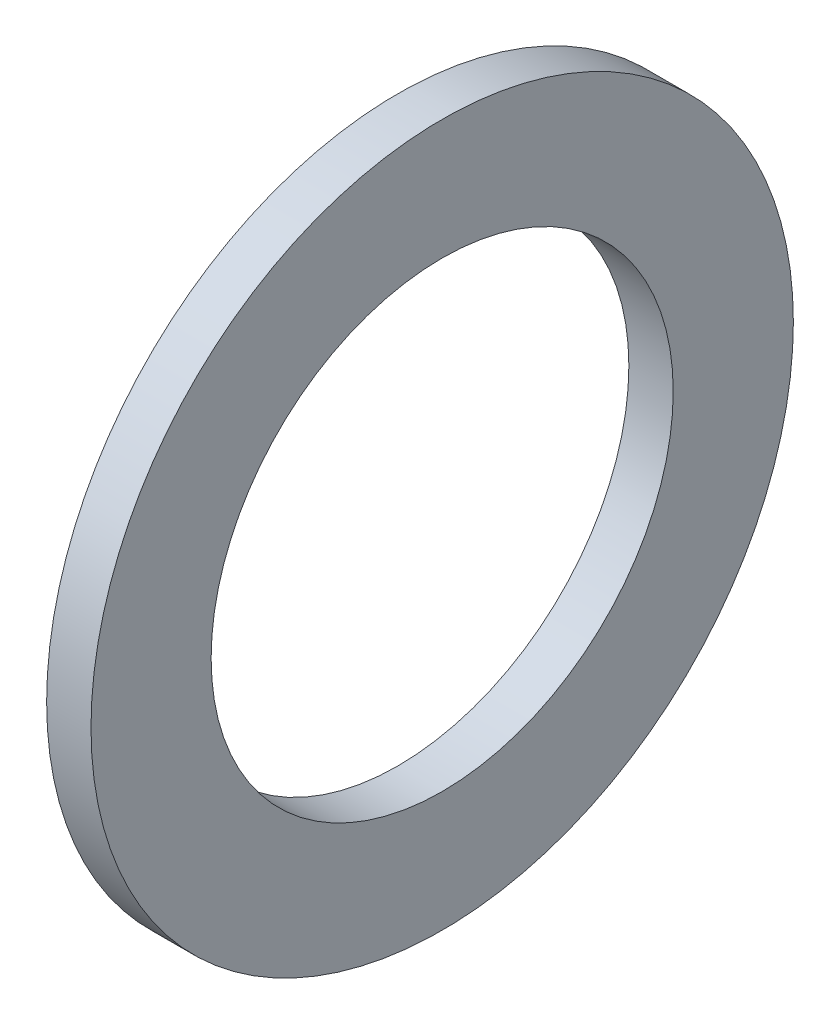
ISO-10303-21;
HEADER;
FILE_DESCRIPTION(('STEP AP214'),'2;1');
FILE_NAME('part.step','',(''),(''),'','','');
FILE_SCHEMA(('AUTOMOTIVE_DESIGN { 1 0 10303 214 1 1 1 1 }'));
ENDSEC;
DATA;
#1=APPLICATION_CONTEXT('core data for automotive mechanical design processes');
#2=APPLICATION_PROTOCOL_DEFINITION('international standard','automotive_design',2000,#1);
#3=PRODUCT_CONTEXT('',#1,'mechanical');
#4=PRODUCT('Part','Part','',(#3));
#5=PRODUCT_RELATED_PRODUCT_CATEGORY('part','',(#4));
#6=PRODUCT_DEFINITION_FORMATION('','',#4);
#7=PRODUCT_DEFINITION_CONTEXT('part definition',#1,'design');
#8=PRODUCT_DEFINITION('design','',#6,#7);
#9=PRODUCT_DEFINITION_SHAPE('','',#8);
#10=(LENGTH_UNIT() NAMED_UNIT(*) SI_UNIT(.MILLI.,.METRE.));
#11=(NAMED_UNIT(*) PLANE_ANGLE_UNIT() SI_UNIT($,.RADIAN.));
#12=(NAMED_UNIT(*) SI_UNIT($,.STERADIAN.) SOLID_ANGLE_UNIT());
#13=UNCERTAINTY_MEASURE_WITH_UNIT(LENGTH_MEASURE(1.E-05),#10,'distance_accuracy_value','');
#14=(GEOMETRIC_REPRESENTATION_CONTEXT(3) GLOBAL_UNCERTAINTY_ASSIGNED_CONTEXT((#13)) GLOBAL_UNIT_ASSIGNED_CONTEXT((#10,
#11,#12)) REPRESENTATION_CONTEXT('',''));
#15=CARTESIAN_POINT('',(0.,0.,0.));
#16=DIRECTION('',(0.,0.,1.));
#17=DIRECTION('',(1.,0.,0.));
#18=AXIS2_PLACEMENT_3D('',#15,#16,#17);
#19=CARTESIAN_POINT('',(0.9144,0.,0.));
#20=DIRECTION('',(1.,0.,0.));
#21=DIRECTION('',(0.,0.,-1.));
#22=AXIS2_PLACEMENT_3D('',#19,#20,#21);
#23=PLANE('',#22);
#24=CARTESIAN_POINT('',(0.9144,0.,0.));
#25=DIRECTION('',(1.,0.,0.));
#26=DIRECTION('',(0.,0.,-1.));
#27=AXIS2_PLACEMENT_3D('',#24,#25,#26);
#28=CIRCLE('',#27,7.239);
#29=CARTESIAN_POINT('',(0.9144,0.,-7.239));
#30=VERTEX_POINT('',#29);
#31=EDGE_CURVE('E10',#30,#30,#28,.T.);
#32=ORIENTED_EDGE('',*,*,#31,.T.);
#33=EDGE_LOOP('',(#32));
#34=FACE_BOUND('',#33,.T.);
#35=CARTESIAN_POINT('',(0.9144,0.,0.));
#36=DIRECTION('',(1.,0.,0.));
#37=DIRECTION('',(0.,0.,-1.));
#38=AXIS2_PLACEMENT_3D('',#35,#36,#37);
#39=CIRCLE('',#38,4.7625);
#40=CARTESIAN_POINT('',(0.9144,0.,-4.7625));
#41=VERTEX_POINT('',#40);
#42=EDGE_CURVE('E43',#41,#41,#39,.T.);
#43=ORIENTED_EDGE('',*,*,#42,.F.);
#44=EDGE_LOOP('',(#43));
#45=FACE_BOUND('',#44,.T.);
#46=ADVANCED_FACE('F32',(#34,#45),#23,.T.);
#47=CARTESIAN_POINT('',(0.,0.,0.));
#48=DIRECTION('',(1.,0.,0.));
#49=DIRECTION('',(0.,0.,-1.));
#50=AXIS2_PLACEMENT_3D('',#47,#48,#49);
#51=PLANE('',#50);
#52=CARTESIAN_POINT('',(0.,0.,0.));
#53=DIRECTION('',(1.,0.,0.));
#54=DIRECTION('',(0.,0.,-1.));
#55=AXIS2_PLACEMENT_3D('',#52,#53,#54);
#56=CIRCLE('',#55,7.239);
#57=CARTESIAN_POINT('',(0.,0.,-7.239));
#58=VERTEX_POINT('',#57);
#59=EDGE_CURVE('E36',#58,#58,#56,.T.);
#60=ORIENTED_EDGE('',*,*,#59,.F.);
#61=EDGE_LOOP('',(#60));
#62=FACE_BOUND('',#61,.T.);
#63=CARTESIAN_POINT('',(0.,0.,0.));
#64=DIRECTION('',(1.,0.,0.));
#65=DIRECTION('',(0.,0.,-1.));
#66=AXIS2_PLACEMENT_3D('',#63,#64,#65);
#67=CIRCLE('',#66,4.7625);
#68=CARTESIAN_POINT('',(0.,0.,-4.7625));
#69=VERTEX_POINT('',#68);
#70=EDGE_CURVE('E45',#69,#69,#67,.T.);
#71=ORIENTED_EDGE('',*,*,#70,.T.);
#72=EDGE_LOOP('',(#71));
#73=FACE_BOUND('',#72,.T.);
#74=ADVANCED_FACE('F55',(#62,#73),#51,.F.);
#75=CARTESIAN_POINT('',(0.9144,0.,0.));
#76=DIRECTION('',(-1.,0.,0.));
#77=DIRECTION('',(0.,0.,1.));
#78=AXIS2_PLACEMENT_3D('',#75,#76,#77);
#79=CYLINDRICAL_SURFACE('',#78,7.239);
#80=ORIENTED_EDGE('',*,*,#31,.F.);
#81=EDGE_LOOP('',(#80));
#82=FACE_BOUND('',#81,.T.);
#83=ORIENTED_EDGE('',*,*,#59,.T.);
#84=EDGE_LOOP('',(#83));
#85=FACE_BOUND('',#84,.T.);
#86=ADVANCED_FACE('F34',(#82,#85),#79,.T.);
#87=CARTESIAN_POINT('',(0.9144,0.,0.));
#88=DIRECTION('',(-1.,0.,0.));
#89=DIRECTION('',(0.,0.,1.));
#90=AXIS2_PLACEMENT_3D('',#87,#88,#89);
#91=CYLINDRICAL_SURFACE('',#90,4.7625);
#92=ORIENTED_EDGE('',*,*,#42,.T.);
#93=EDGE_LOOP('',(#92));
#94=FACE_BOUND('',#93,.T.);
#95=ORIENTED_EDGE('',*,*,#70,.F.);
#96=EDGE_LOOP('',(#95));
#97=FACE_BOUND('',#96,.T.);
#98=ADVANCED_FACE('F51',(#94,#97),#91,.F.);
#99=CLOSED_SHELL('',(#46,#74,#86,#98));
#100=MANIFOLD_SOLID_BREP('B2',#99);
#101=ADVANCED_BREP_SHAPE_REPRESENTATION('',(#18,#100),#14);
#102=SHAPE_DEFINITION_REPRESENTATION(#9,#101);
ENDSEC;
END-ISO-10303-21;
